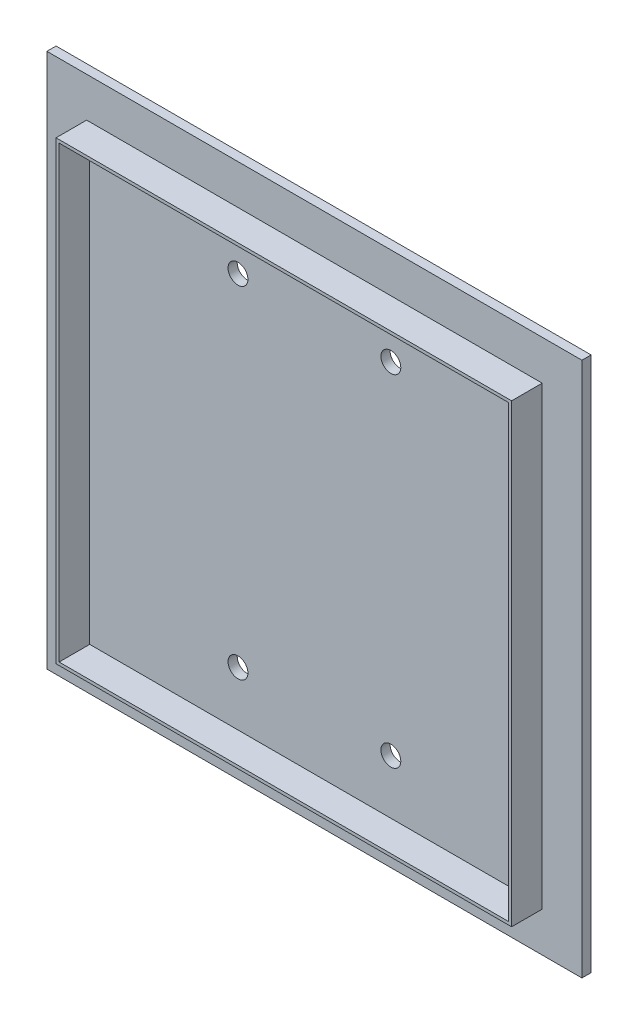
ISO-10303-21;
HEADER;
FILE_DESCRIPTION(('STEP AP214'),'2;1');
FILE_NAME('part.step','',(''),(''),'','','');
FILE_SCHEMA(('AUTOMOTIVE_DESIGN { 1 0 10303 214 1 1 1 1 }'));
ENDSEC;
DATA;
#1=APPLICATION_CONTEXT('core data for automotive mechanical design processes');
#2=APPLICATION_PROTOCOL_DEFINITION('international standard','automotive_design',2000,#1);
#3=PRODUCT_CONTEXT('',#1,'mechanical');
#4=PRODUCT('Part','Part','',(#3));
#5=PRODUCT_RELATED_PRODUCT_CATEGORY('part','',(#4));
#6=PRODUCT_DEFINITION_FORMATION('','',#4);
#7=PRODUCT_DEFINITION_CONTEXT('part definition',#1,'design');
#8=PRODUCT_DEFINITION('design','',#6,#7);
#9=PRODUCT_DEFINITION_SHAPE('','',#8);
#10=(LENGTH_UNIT() NAMED_UNIT(*) SI_UNIT(.MILLI.,.METRE.));
#11=(NAMED_UNIT(*) PLANE_ANGLE_UNIT() SI_UNIT($,.RADIAN.));
#12=(NAMED_UNIT(*) SI_UNIT($,.STERADIAN.) SOLID_ANGLE_UNIT());
#13=UNCERTAINTY_MEASURE_WITH_UNIT(LENGTH_MEASURE(1.E-05),#10,'distance_accuracy_value','');
#14=(GEOMETRIC_REPRESENTATION_CONTEXT(3) GLOBAL_UNCERTAINTY_ASSIGNED_CONTEXT((#13)) GLOBAL_UNIT_ASSIGNED_CONTEXT((#10,
#11,#12)) REPRESENTATION_CONTEXT('',''));
#15=CARTESIAN_POINT('',(0.,0.,0.));
#16=DIRECTION('',(0.,0.,1.));
#17=DIRECTION('',(1.,0.,0.));
#18=AXIS2_PLACEMENT_3D('',#15,#16,#17);
#19=CARTESIAN_POINT('',(0.,0.,0.));
#20=DIRECTION('',(0.,0.,-1.));
#21=DIRECTION('',(-1.,0.,0.));
#22=AXIS2_PLACEMENT_3D('',#19,#20,#21);
#23=PLANE('',#22);
#24=CARTESIAN_POINT('',(-50.,111.5,0.));
#25=DIRECTION('',(0.,0.,-1.));
#26=DIRECTION('',(-1.,0.,0.));
#27=AXIS2_PLACEMENT_3D('',#24,#25,#26);
#28=CIRCLE('',#27,6.50000000000001);
#29=CARTESIAN_POINT('',(-56.5,111.5,0.));
#30=VERTEX_POINT('',#29);
#31=EDGE_CURVE('E228',#30,#30,#28,.F.);
#32=ORIENTED_EDGE('',*,*,#31,.T.);
#33=EDGE_LOOP('',(#32));
#34=FACE_BOUND('',#33,.T.);
#35=CARTESIAN_POINT('',(50.,111.5,0.));
#36=DIRECTION('',(0.,0.,-1.));
#37=DIRECTION('',(-1.,0.,0.));
#38=AXIS2_PLACEMENT_3D('',#35,#36,#37);
#39=CIRCLE('',#38,6.50000000000001);
#40=CARTESIAN_POINT('',(43.5,111.5,0.));
#41=VERTEX_POINT('',#40);
#42=EDGE_CURVE('E225',#41,#41,#39,.T.);
#43=ORIENTED_EDGE('',*,*,#42,.F.);
#44=EDGE_LOOP('',(#43));
#45=FACE_BOUND('',#44,.T.);
#46=DIRECTION('',(0.,1.,0.));
#47=VECTOR('',#46,1.);
#48=CARTESIAN_POINT('',(175.,-175.,0.));
#49=LINE('',#48,#47);
#50=CARTESIAN_POINT('',(175.,-175.,0.));
#51=VERTEX_POINT('',#50);
#52=CARTESIAN_POINT('',(175.,175.,0.));
#53=VERTEX_POINT('',#52);
#54=EDGE_CURVE('E205',#51,#53,#49,.T.);
#55=ORIENTED_EDGE('',*,*,#54,.F.);
#56=DIRECTION('',(1.,0.,0.));
#57=VECTOR('',#56,1.);
#58=CARTESIAN_POINT('',(-175.,-175.,0.));
#59=LINE('',#58,#57);
#60=CARTESIAN_POINT('',(-175.,-175.,0.));
#61=VERTEX_POINT('',#60);
#62=EDGE_CURVE('E214',#61,#51,#59,.T.);
#63=ORIENTED_EDGE('',*,*,#62,.F.);
#64=DIRECTION('',(0.,-1.,0.));
#65=VECTOR('',#64,1.);
#66=CARTESIAN_POINT('',(-175.,-175.,0.));
#67=LINE('',#66,#65);
#68=CARTESIAN_POINT('',(-175.,175.,0.));
#69=VERTEX_POINT('',#68);
#70=EDGE_CURVE('E211',#69,#61,#67,.T.);
#71=ORIENTED_EDGE('',*,*,#70,.F.);
#72=DIRECTION('',(-1.,0.,0.));
#73=VECTOR('',#72,1.);
#74=CARTESIAN_POINT('',(-175.,175.,0.));
#75=LINE('',#74,#73);
#76=EDGE_CURVE('E208',#53,#69,#75,.T.);
#77=ORIENTED_EDGE('',*,*,#76,.F.);
#78=EDGE_LOOP('',(#55,#63,#71,#77));
#79=FACE_BOUND('',#78,.T.);
#80=CARTESIAN_POINT('',(-50.,-111.5,0.));
#81=DIRECTION('',(0.,0.,-1.));
#82=DIRECTION('',(-1.,0.,0.));
#83=AXIS2_PLACEMENT_3D('',#80,#81,#82);
#84=CIRCLE('',#83,6.50000000000001);
#85=CARTESIAN_POINT('',(-56.5,-111.5,0.));
#86=VERTEX_POINT('',#85);
#87=EDGE_CURVE('E231',#86,#86,#84,.T.);
#88=ORIENTED_EDGE('',*,*,#87,.F.);
#89=EDGE_LOOP('',(#88));
#90=FACE_BOUND('',#89,.T.);
#91=CARTESIAN_POINT('',(50.,-111.5,0.));
#92=DIRECTION('',(0.,0.,-1.));
#93=DIRECTION('',(-1.,0.,0.));
#94=AXIS2_PLACEMENT_3D('',#91,#92,#93);
#95=CIRCLE('',#94,6.50000000000001);
#96=CARTESIAN_POINT('',(43.5,-111.5,0.));
#97=VERTEX_POINT('',#96);
#98=EDGE_CURVE('E150',#97,#97,#95,.F.);
#99=ORIENTED_EDGE('',*,*,#98,.T.);
#100=EDGE_LOOP('',(#99));
#101=FACE_BOUND('',#100,.T.);
#102=ADVANCED_FACE('F33',(#34,#45,#79,#90,#101),#23,.T.);
#103=CARTESIAN_POINT('',(0.,0.,6.));
#104=DIRECTION('',(0.,0.,1.));
#105=DIRECTION('',(1.,0.,0.));
#106=AXIS2_PLACEMENT_3D('',#103,#104,#105);
#107=PLANE('',#106);
#108=CARTESIAN_POINT('',(-50.,111.5,6.));
#109=DIRECTION('',(0.,0.,1.));
#110=DIRECTION('',(1.,0.,0.));
#111=AXIS2_PLACEMENT_3D('',#108,#109,#110);
#112=CIRCLE('',#111,6.50000000000001);
#113=CARTESIAN_POINT('',(-56.5,111.5,6.));
#114=VERTEX_POINT('',#113);
#115=EDGE_CURVE('E226',#114,#114,#112,.F.);
#116=ORIENTED_EDGE('',*,*,#115,.T.);
#117=EDGE_LOOP('',(#116));
#118=FACE_BOUND('',#117,.T.);
#119=CARTESIAN_POINT('',(50.,111.5,6.));
#120=DIRECTION('',(0.,0.,1.));
#121=DIRECTION('',(1.,0.,0.));
#122=AXIS2_PLACEMENT_3D('',#119,#120,#121);
#123=CIRCLE('',#122,6.50000000000001);
#124=CARTESIAN_POINT('',(43.5,111.5,6.));
#125=VERTEX_POINT('',#124);
#126=EDGE_CURVE('E222',#125,#125,#123,.T.);
#127=ORIENTED_EDGE('',*,*,#126,.F.);
#128=EDGE_LOOP('',(#127));
#129=FACE_BOUND('',#128,.T.);
#130=DIRECTION('',(0.,1.,0.));
#131=VECTOR('',#130,1.);
#132=CARTESIAN_POINT('',(147.,147.,6.));
#133=LINE('',#132,#131);
#134=CARTESIAN_POINT('',(147.,-147.,6.));
#135=VERTEX_POINT('',#134);
#136=CARTESIAN_POINT('',(147.,147.,6.));
#137=VERTEX_POINT('',#136);
#138=EDGE_CURVE('E125',#135,#137,#133,.T.);
#139=ORIENTED_EDGE('',*,*,#138,.T.);
#140=DIRECTION('',(-1.,0.,0.));
#141=VECTOR('',#140,1.);
#142=CARTESIAN_POINT('',(-147.,147.,6.));
#143=LINE('',#142,#141);
#144=CARTESIAN_POINT('',(-147.,147.,6.));
#145=VERTEX_POINT('',#144);
#146=EDGE_CURVE('E134',#137,#145,#143,.T.);
#147=ORIENTED_EDGE('',*,*,#146,.T.);
#148=DIRECTION('',(0.,-1.,0.));
#149=VECTOR('',#148,1.);
#150=CARTESIAN_POINT('',(-147.,147.,6.));
#151=LINE('',#150,#149);
#152=CARTESIAN_POINT('',(-147.,-147.,6.));
#153=VERTEX_POINT('',#152);
#154=EDGE_CURVE('E139',#145,#153,#151,.T.);
#155=ORIENTED_EDGE('',*,*,#154,.T.);
#156=DIRECTION('',(1.,0.,0.));
#157=VECTOR('',#156,1.);
#158=CARTESIAN_POINT('',(-147.,-147.,6.));
#159=LINE('',#158,#157);
#160=EDGE_CURVE('E131',#153,#135,#159,.T.);
#161=ORIENTED_EDGE('',*,*,#160,.T.);
#162=EDGE_LOOP('',(#139,#147,#155,#161));
#163=FACE_BOUND('',#162,.T.);
#164=CARTESIAN_POINT('',(-50.,-111.5,6.));
#165=DIRECTION('',(0.,0.,1.));
#166=DIRECTION('',(1.,0.,0.));
#167=AXIS2_PLACEMENT_3D('',#164,#165,#166);
#168=CIRCLE('',#167,6.50000000000001);
#169=CARTESIAN_POINT('',(-56.5,-111.5,6.));
#170=VERTEX_POINT('',#169);
#171=EDGE_CURVE('E229',#170,#170,#168,.T.);
#172=ORIENTED_EDGE('',*,*,#171,.F.);
#173=EDGE_LOOP('',(#172));
#174=FACE_BOUND('',#173,.T.);
#175=CARTESIAN_POINT('',(50.,-111.5,6.));
#176=DIRECTION('',(0.,0.,1.));
#177=DIRECTION('',(1.,0.,0.));
#178=AXIS2_PLACEMENT_3D('',#175,#176,#177);
#179=CIRCLE('',#178,6.50000000000001);
#180=CARTESIAN_POINT('',(43.5,-111.5,6.));
#181=VERTEX_POINT('',#180);
#182=EDGE_CURVE('E37',#181,#181,#179,.F.);
#183=ORIENTED_EDGE('',*,*,#182,.T.);
#184=EDGE_LOOP('',(#183));
#185=FACE_BOUND('',#184,.T.);
#186=ADVANCED_FACE('F141',(#118,#129,#163,#174,#185),#107,.T.);
#187=CARTESIAN_POINT('',(175.,-175.,26.));
#188=DIRECTION('',(-1.,0.,0.));
#189=DIRECTION('',(0.,0.,1.));
#190=AXIS2_PLACEMENT_3D('',#187,#188,#189);
#191=PLANE('',#190);
#192=DIRECTION('',(0.,1.,0.));
#193=VECTOR('',#192,1.);
#194=CARTESIAN_POINT('',(175.,175.,6.));
#195=LINE('',#194,#193);
#196=CARTESIAN_POINT('',(175.,-175.,6.));
#197=VERTEX_POINT('',#196);
#198=CARTESIAN_POINT('',(175.,175.,6.));
#199=VERTEX_POINT('',#198);
#200=EDGE_CURVE('E192',#197,#199,#195,.T.);
#201=ORIENTED_EDGE('',*,*,#200,.F.);
#202=DIRECTION('',(0.,0.,-1.));
#203=VECTOR('',#202,1.);
#204=CARTESIAN_POINT('',(175.,-175.,26.));
#205=LINE('',#204,#203);
#206=EDGE_CURVE('E217',#197,#51,#205,.T.);
#207=ORIENTED_EDGE('',*,*,#206,.T.);
#208=ORIENTED_EDGE('',*,*,#54,.T.);
#209=DIRECTION('',(0.,0.,-1.));
#210=VECTOR('',#209,1.);
#211=CARTESIAN_POINT('',(175.,175.,26.));
#212=LINE('',#211,#210);
#213=EDGE_CURVE('E11',#199,#53,#212,.T.);
#214=ORIENTED_EDGE('',*,*,#213,.F.);
#215=EDGE_LOOP('',(#201,#207,#208,#214));
#216=FACE_BOUND('',#215,.T.);
#217=ADVANCED_FACE('F35',(#216),#191,.F.);
#218=CARTESIAN_POINT('',(-175.,175.,26.));
#219=DIRECTION('',(0.,-1.,0.));
#220=DIRECTION('',(0.,0.,-1.));
#221=AXIS2_PLACEMENT_3D('',#218,#219,#220);
#222=PLANE('',#221);
#223=DIRECTION('',(-1.,0.,0.));
#224=VECTOR('',#223,1.);
#225=CARTESIAN_POINT('',(-175.,175.,6.));
#226=LINE('',#225,#224);
#227=CARTESIAN_POINT('',(-175.,175.,6.));
#228=VERTEX_POINT('',#227);
#229=EDGE_CURVE('E200',#199,#228,#226,.T.);
#230=ORIENTED_EDGE('',*,*,#229,.F.);
#231=ORIENTED_EDGE('',*,*,#213,.T.);
#232=ORIENTED_EDGE('',*,*,#76,.T.);
#233=DIRECTION('',(0.,0.,-1.));
#234=VECTOR('',#233,1.);
#235=CARTESIAN_POINT('',(-175.,175.,26.));
#236=LINE('',#235,#234);
#237=EDGE_CURVE('E42',#228,#69,#236,.T.);
#238=ORIENTED_EDGE('',*,*,#237,.F.);
#239=EDGE_LOOP('',(#230,#231,#232,#238));
#240=FACE_BOUND('',#239,.T.);
#241=ADVANCED_FACE('F321',(#240),#222,.F.);
#242=CARTESIAN_POINT('',(-175.,-175.,26.));
#243=DIRECTION('',(1.,0.,0.));
#244=DIRECTION('',(0.,0.,-1.));
#245=AXIS2_PLACEMENT_3D('',#242,#243,#244);
#246=PLANE('',#245);
#247=DIRECTION('',(0.,-1.,0.));
#248=VECTOR('',#247,1.);
#249=CARTESIAN_POINT('',(-175.,175.,6.));
#250=LINE('',#249,#248);
#251=CARTESIAN_POINT('',(-175.,-175.,6.00000000000001));
#252=VERTEX_POINT('',#251);
#253=EDGE_CURVE('E58',#228,#252,#250,.T.);
#254=ORIENTED_EDGE('',*,*,#253,.F.);
#255=ORIENTED_EDGE('',*,*,#237,.T.);
#256=ORIENTED_EDGE('',*,*,#70,.T.);
#257=DIRECTION('',(0.,0.,-1.));
#258=VECTOR('',#257,1.);
#259=CARTESIAN_POINT('',(-175.,-175.,26.));
#260=LINE('',#259,#258);
#261=EDGE_CURVE('E219',#252,#61,#260,.T.);
#262=ORIENTED_EDGE('',*,*,#261,.F.);
#263=EDGE_LOOP('',(#254,#255,#256,#262));
#264=FACE_BOUND('',#263,.T.);
#265=ADVANCED_FACE('F318',(#264),#246,.F.);
#266=CARTESIAN_POINT('',(-175.,-175.,26.));
#267=DIRECTION('',(0.,1.,0.));
#268=DIRECTION('',(0.,0.,1.));
#269=AXIS2_PLACEMENT_3D('',#266,#267,#268);
#270=PLANE('',#269);
#271=DIRECTION('',(1.,0.,0.));
#272=VECTOR('',#271,1.);
#273=CARTESIAN_POINT('',(-175.,-175.,6.));
#274=LINE('',#273,#272);
#275=EDGE_CURVE('E203',#252,#197,#274,.T.);
#276=ORIENTED_EDGE('',*,*,#275,.F.);
#277=ORIENTED_EDGE('',*,*,#261,.T.);
#278=ORIENTED_EDGE('',*,*,#62,.T.);
#279=ORIENTED_EDGE('',*,*,#206,.F.);
#280=EDGE_LOOP('',(#276,#277,#278,#279));
#281=FACE_BOUND('',#280,.T.);
#282=ADVANCED_FACE('F311',(#281),#270,.F.);
#283=CARTESIAN_POINT('',(0.,0.,6.));
#284=DIRECTION('',(0.,0.,1.));
#285=DIRECTION('',(1.,0.,0.));
#286=AXIS2_PLACEMENT_3D('',#283,#284,#285);
#287=PLANE('',#286);
#288=DIRECTION('',(1.,0.,0.));
#289=VECTOR('',#288,1.);
#290=CARTESIAN_POINT('',(-149.,-149.,6.));
#291=LINE('',#290,#289);
#292=CARTESIAN_POINT('',(-149.,-149.,6.));
#293=VERTEX_POINT('',#292);
#294=CARTESIAN_POINT('',(149.,-149.,6.));
#295=VERTEX_POINT('',#294);
#296=EDGE_CURVE('E176',#293,#295,#291,.T.);
#297=ORIENTED_EDGE('',*,*,#296,.F.);
#298=DIRECTION('',(0.,-1.,0.));
#299=VECTOR('',#298,1.);
#300=CARTESIAN_POINT('',(-149.,149.,6.));
#301=LINE('',#300,#299);
#302=CARTESIAN_POINT('',(-149.,149.,6.));
#303=VERTEX_POINT('',#302);
#304=EDGE_CURVE('E173',#303,#293,#301,.T.);
#305=ORIENTED_EDGE('',*,*,#304,.F.);
#306=DIRECTION('',(-1.,0.,0.));
#307=VECTOR('',#306,1.);
#308=CARTESIAN_POINT('',(-149.,149.,6.));
#309=LINE('',#308,#307);
#310=CARTESIAN_POINT('',(149.,149.,6.));
#311=VERTEX_POINT('',#310);
#312=EDGE_CURVE('E169',#311,#303,#309,.T.);
#313=ORIENTED_EDGE('',*,*,#312,.F.);
#314=DIRECTION('',(0.,1.,0.));
#315=VECTOR('',#314,1.);
#316=CARTESIAN_POINT('',(149.,149.,6.));
#317=LINE('',#316,#315);
#318=EDGE_CURVE('E166',#295,#311,#317,.T.);
#319=ORIENTED_EDGE('',*,*,#318,.F.);
#320=EDGE_LOOP('',(#297,#305,#313,#319));
#321=FACE_BOUND('',#320,.T.);
#322=ORIENTED_EDGE('',*,*,#200,.T.);
#323=ORIENTED_EDGE('',*,*,#229,.T.);
#324=ORIENTED_EDGE('',*,*,#253,.T.);
#325=ORIENTED_EDGE('',*,*,#275,.T.);
#326=EDGE_LOOP('',(#322,#323,#324,#325));
#327=FACE_BOUND('',#326,.T.);
#328=ADVANCED_FACE('F307',(#321,#327),#287,.T.);
#329=CARTESIAN_POINT('',(149.,149.,6.));
#330=DIRECTION('',(1.,0.,0.));
#331=DIRECTION('',(0.,1.,0.));
#332=AXIS2_PLACEMENT_3D('',#329,#330,#331);
#333=PLANE('',#332);
#334=DIRECTION('',(0.,1.,0.));
#335=VECTOR('',#334,1.);
#336=CARTESIAN_POINT('',(149.,149.,26.));
#337=LINE('',#336,#335);
#338=CARTESIAN_POINT('',(149.,-149.,26.));
#339=VERTEX_POINT('',#338);
#340=CARTESIAN_POINT('',(149.,149.,26.));
#341=VERTEX_POINT('',#340);
#342=EDGE_CURVE('E162',#339,#341,#337,.T.);
#343=ORIENTED_EDGE('',*,*,#342,.F.);
#344=DIRECTION('',(0.,0.,1.));
#345=VECTOR('',#344,1.);
#346=CARTESIAN_POINT('',(149.,-149.,6.));
#347=LINE('',#346,#345);
#348=EDGE_CURVE('E190',#295,#339,#347,.T.);
#349=ORIENTED_EDGE('',*,*,#348,.F.);
#350=ORIENTED_EDGE('',*,*,#318,.T.);
#351=DIRECTION('',(0.,0.,1.));
#352=VECTOR('',#351,1.);
#353=CARTESIAN_POINT('',(149.,149.,6.));
#354=LINE('',#353,#352);
#355=EDGE_CURVE('E179',#311,#341,#354,.T.);
#356=ORIENTED_EDGE('',*,*,#355,.T.);
#357=EDGE_LOOP('',(#343,#349,#350,#356));
#358=FACE_BOUND('',#357,.T.);
#359=ADVANCED_FACE('F296',(#358),#333,.T.);
#360=CARTESIAN_POINT('',(-149.,-149.,6.));
#361=DIRECTION('',(0.,-1.,0.));
#362=DIRECTION('',(0.,0.,-1.));
#363=AXIS2_PLACEMENT_3D('',#360,#361,#362);
#364=PLANE('',#363);
#365=DIRECTION('',(1.,0.,0.));
#366=VECTOR('',#365,1.);
#367=CARTESIAN_POINT('',(-149.,-149.,26.));
#368=LINE('',#367,#366);
#369=CARTESIAN_POINT('',(-149.,-149.,26.));
#370=VERTEX_POINT('',#369);
#371=EDGE_CURVE('E170',#370,#339,#368,.T.);
#372=ORIENTED_EDGE('',*,*,#371,.F.);
#373=DIRECTION('',(0.,0.,1.));
#374=VECTOR('',#373,1.);
#375=CARTESIAN_POINT('',(-149.,-149.,6.));
#376=LINE('',#375,#374);
#377=EDGE_CURVE('E193',#293,#370,#376,.T.);
#378=ORIENTED_EDGE('',*,*,#377,.F.);
#379=ORIENTED_EDGE('',*,*,#296,.T.);
#380=ORIENTED_EDGE('',*,*,#348,.T.);
#381=EDGE_LOOP('',(#372,#378,#379,#380));
#382=FACE_BOUND('',#381,.T.);
#383=ADVANCED_FACE('F292',(#382),#364,.T.);
#384=CARTESIAN_POINT('',(-149.,149.,6.));
#385=DIRECTION('',(-1.,0.,0.));
#386=DIRECTION('',(0.,-1.,0.));
#387=AXIS2_PLACEMENT_3D('',#384,#385,#386);
#388=PLANE('',#387);
#389=DIRECTION('',(0.,-1.,0.));
#390=VECTOR('',#389,1.);
#391=CARTESIAN_POINT('',(-149.,149.,26.));
#392=LINE('',#391,#390);
#393=CARTESIAN_POINT('',(-149.,149.,26.));
#394=VERTEX_POINT('',#393);
#395=EDGE_CURVE('E185',#394,#370,#392,.T.);
#396=ORIENTED_EDGE('',*,*,#395,.F.);
#397=DIRECTION('',(0.,0.,1.));
#398=VECTOR('',#397,1.);
#399=CARTESIAN_POINT('',(-149.,149.,6.));
#400=LINE('',#399,#398);
#401=EDGE_CURVE('E195',#303,#394,#400,.T.);
#402=ORIENTED_EDGE('',*,*,#401,.F.);
#403=ORIENTED_EDGE('',*,*,#304,.T.);
#404=ORIENTED_EDGE('',*,*,#377,.T.);
#405=EDGE_LOOP('',(#396,#402,#403,#404));
#406=FACE_BOUND('',#405,.T.);
#407=ADVANCED_FACE('F295',(#406),#388,.T.);
#408=CARTESIAN_POINT('',(-149.,149.,6.));
#409=DIRECTION('',(0.,1.,0.));
#410=DIRECTION('',(0.,0.,1.));
#411=AXIS2_PLACEMENT_3D('',#408,#409,#410);
#412=PLANE('',#411);
#413=DIRECTION('',(-1.,0.,0.));
#414=VECTOR('',#413,1.);
#415=CARTESIAN_POINT('',(-149.,149.,26.));
#416=LINE('',#415,#414);
#417=EDGE_CURVE('E182',#341,#394,#416,.T.);
#418=ORIENTED_EDGE('',*,*,#417,.F.);
#419=ORIENTED_EDGE('',*,*,#355,.F.);
#420=ORIENTED_EDGE('',*,*,#312,.T.);
#421=ORIENTED_EDGE('',*,*,#401,.T.);
#422=EDGE_LOOP('',(#418,#419,#420,#421));
#423=FACE_BOUND('',#422,.T.);
#424=ADVANCED_FACE('F300',(#423),#412,.T.);
#425=CARTESIAN_POINT('',(0.,0.,26.));
#426=DIRECTION('',(0.,0.,-1.));
#427=DIRECTION('',(-1.,0.,0.));
#428=AXIS2_PLACEMENT_3D('',#425,#426,#427);
#429=PLANE('',#428);
#430=DIRECTION('',(-1.,0.,0.));
#431=VECTOR('',#430,1.);
#432=CARTESIAN_POINT('',(-147.,147.,26.));
#433=LINE('',#432,#431);
#434=CARTESIAN_POINT('',(147.,147.,26.));
#435=VERTEX_POINT('',#434);
#436=CARTESIAN_POINT('',(-147.,147.,26.));
#437=VERTEX_POINT('',#436);
#438=EDGE_CURVE('E156',#435,#437,#433,.T.);
#439=ORIENTED_EDGE('',*,*,#438,.F.);
#440=DIRECTION('',(0.,1.,0.));
#441=VECTOR('',#440,1.);
#442=CARTESIAN_POINT('',(147.,147.,26.));
#443=LINE('',#442,#441);
#444=CARTESIAN_POINT('',(147.,-147.,26.));
#445=VERTEX_POINT('',#444);
#446=EDGE_CURVE('E50',#445,#435,#443,.T.);
#447=ORIENTED_EDGE('',*,*,#446,.F.);
#448=DIRECTION('',(1.,0.,0.));
#449=VECTOR('',#448,1.);
#450=CARTESIAN_POINT('',(-147.,-147.,26.));
#451=LINE('',#450,#449);
#452=CARTESIAN_POINT('',(-147.,-147.,26.));
#453=VERTEX_POINT('',#452);
#454=EDGE_CURVE('E144',#453,#445,#451,.T.);
#455=ORIENTED_EDGE('',*,*,#454,.F.);
#456=DIRECTION('',(0.,-1.,0.));
#457=VECTOR('',#456,1.);
#458=CARTESIAN_POINT('',(-147.,147.,26.));
#459=LINE('',#458,#457);
#460=EDGE_CURVE('E147',#437,#453,#459,.T.);
#461=ORIENTED_EDGE('',*,*,#460,.F.);
#462=EDGE_LOOP('',(#439,#447,#455,#461));
#463=FACE_BOUND('',#462,.T.);
#464=ORIENTED_EDGE('',*,*,#342,.T.);
#465=ORIENTED_EDGE('',*,*,#417,.T.);
#466=ORIENTED_EDGE('',*,*,#395,.T.);
#467=ORIENTED_EDGE('',*,*,#371,.T.);
#468=EDGE_LOOP('',(#464,#465,#466,#467));
#469=FACE_BOUND('',#468,.T.);
#470=ADVANCED_FACE('F291',(#463,#469),#429,.F.);
#471=CARTESIAN_POINT('',(147.,147.,6.));
#472=DIRECTION('',(1.,0.,0.));
#473=DIRECTION('',(0.,0.,-1.));
#474=AXIS2_PLACEMENT_3D('',#471,#472,#473);
#475=PLANE('',#474);
#476=ORIENTED_EDGE('',*,*,#446,.T.);
#477=DIRECTION('',(0.,0.,1.));
#478=VECTOR('',#477,1.);
#479=CARTESIAN_POINT('',(147.,147.,6.));
#480=LINE('',#479,#478);
#481=EDGE_CURVE('E121',#137,#435,#480,.T.);
#482=ORIENTED_EDGE('',*,*,#481,.F.);
#483=ORIENTED_EDGE('',*,*,#138,.F.);
#484=DIRECTION('',(0.,0.,1.));
#485=VECTOR('',#484,1.);
#486=CARTESIAN_POINT('',(147.,-147.,6.));
#487=LINE('',#486,#485);
#488=EDGE_CURVE('E160',#135,#445,#487,.T.);
#489=ORIENTED_EDGE('',*,*,#488,.T.);
#490=EDGE_LOOP('',(#476,#482,#483,#489));
#491=FACE_BOUND('',#490,.T.);
#492=ADVANCED_FACE('F123',(#491),#475,.F.);
#493=CARTESIAN_POINT('',(-147.,-147.,6.));
#494=DIRECTION('',(0.,-1.,0.));
#495=DIRECTION('',(0.,0.,-1.));
#496=AXIS2_PLACEMENT_3D('',#493,#494,#495);
#497=PLANE('',#496);
#498=ORIENTED_EDGE('',*,*,#454,.T.);
#499=ORIENTED_EDGE('',*,*,#488,.F.);
#500=ORIENTED_EDGE('',*,*,#160,.F.);
#501=DIRECTION('',(0.,0.,1.));
#502=VECTOR('',#501,1.);
#503=CARTESIAN_POINT('',(-147.,-147.,6.));
#504=LINE('',#503,#502);
#505=EDGE_CURVE('E163',#153,#453,#504,.T.);
#506=ORIENTED_EDGE('',*,*,#505,.T.);
#507=EDGE_LOOP('',(#498,#499,#500,#506));
#508=FACE_BOUND('',#507,.T.);
#509=ADVANCED_FACE('F279',(#508),#497,.F.);
#510=CARTESIAN_POINT('',(-147.,147.,6.));
#511=DIRECTION('',(-1.,0.,0.));
#512=DIRECTION('',(0.,-1.,0.));
#513=AXIS2_PLACEMENT_3D('',#510,#511,#512);
#514=PLANE('',#513);
#515=ORIENTED_EDGE('',*,*,#460,.T.);
#516=ORIENTED_EDGE('',*,*,#505,.F.);
#517=ORIENTED_EDGE('',*,*,#154,.F.);
#518=DIRECTION('',(0.,0.,1.));
#519=VECTOR('',#518,1.);
#520=CARTESIAN_POINT('',(-147.,147.,6.));
#521=LINE('',#520,#519);
#522=EDGE_CURVE('E130',#145,#437,#521,.T.);
#523=ORIENTED_EDGE('',*,*,#522,.T.);
#524=EDGE_LOOP('',(#515,#516,#517,#523));
#525=FACE_BOUND('',#524,.T.);
#526=ADVANCED_FACE('F282',(#525),#514,.F.);
#527=CARTESIAN_POINT('',(-147.,147.,6.));
#528=DIRECTION('',(0.,1.,0.));
#529=DIRECTION('',(0.,0.,1.));
#530=AXIS2_PLACEMENT_3D('',#527,#528,#529);
#531=PLANE('',#530);
#532=ORIENTED_EDGE('',*,*,#438,.T.);
#533=ORIENTED_EDGE('',*,*,#522,.F.);
#534=ORIENTED_EDGE('',*,*,#146,.F.);
#535=ORIENTED_EDGE('',*,*,#481,.T.);
#536=EDGE_LOOP('',(#532,#533,#534,#535));
#537=FACE_BOUND('',#536,.T.);
#538=ADVANCED_FACE('F135',(#537),#531,.F.);
#539=CARTESIAN_POINT('',(50.,111.5,26.));
#540=DIRECTION('',(0.,0.,-1.));
#541=DIRECTION('',(-1.,0.,0.));
#542=AXIS2_PLACEMENT_3D('',#539,#540,#541);
#543=CYLINDRICAL_SURFACE('',#542,6.50000000000001);
#544=CARTESIAN_POINT('',(43.5,111.5,0.));
#545=CARTESIAN_POINT('',(43.5,111.5,0.0625000000000001));
#546=CARTESIAN_POINT('',(43.5,111.5,0.125));
#547=CARTESIAN_POINT('',(43.5,111.5,0.25));
#548=CARTESIAN_POINT('',(43.5,111.5,0.3125));
#549=CARTESIAN_POINT('',(43.5,111.5,0.4375));
#550=CARTESIAN_POINT('',(43.5,111.5,0.5));
#551=CARTESIAN_POINT('',(43.5,111.5,0.625000000000001));
#552=CARTESIAN_POINT('',(43.5,111.5,0.687500000000001));
#553=CARTESIAN_POINT('',(43.5,111.5,0.812500000000001));
#554=CARTESIAN_POINT('',(43.5,111.5,0.875000000000001));
#555=CARTESIAN_POINT('',(43.5,111.5,1.));
#556=CARTESIAN_POINT('',(43.5,111.5,1.0625));
#557=CARTESIAN_POINT('',(43.5,111.5,1.1875));
#558=CARTESIAN_POINT('',(43.5,111.5,1.25));
#559=CARTESIAN_POINT('',(43.5,111.5,1.375));
#560=CARTESIAN_POINT('',(43.5,111.5,1.4375));
#561=CARTESIAN_POINT('',(43.5,111.5,1.5625));
#562=CARTESIAN_POINT('',(43.5,111.5,1.625));
#563=CARTESIAN_POINT('',(43.5,111.5,1.75));
#564=CARTESIAN_POINT('',(43.5,111.5,1.8125));
#565=CARTESIAN_POINT('',(43.5,111.5,1.9375));
#566=CARTESIAN_POINT('',(43.5,111.5,2.));
#567=CARTESIAN_POINT('',(43.5,111.5,2.125));
#568=CARTESIAN_POINT('',(43.5,111.5,2.1875));
#569=CARTESIAN_POINT('',(43.5,111.5,2.3125));
#570=CARTESIAN_POINT('',(43.5,111.5,2.375));
#571=CARTESIAN_POINT('',(43.5,111.5,2.5));
#572=CARTESIAN_POINT('',(43.5,111.5,2.5625));
#573=CARTESIAN_POINT('',(43.5,111.5,2.6875));
#574=CARTESIAN_POINT('',(43.5,111.5,2.75));
#575=CARTESIAN_POINT('',(43.5,111.5,2.875));
#576=CARTESIAN_POINT('',(43.5,111.5,2.9375));
#577=CARTESIAN_POINT('',(43.5,111.5,3.0625));
#578=CARTESIAN_POINT('',(43.5,111.5,3.125));
#579=CARTESIAN_POINT('',(43.5,111.5,3.25));
#580=CARTESIAN_POINT('',(43.5,111.5,3.3125));
#581=CARTESIAN_POINT('',(43.5,111.5,3.4375));
#582=CARTESIAN_POINT('',(43.5,111.5,3.5));
#583=CARTESIAN_POINT('',(43.5,111.5,3.625));
#584=CARTESIAN_POINT('',(43.5,111.5,3.6875));
#585=CARTESIAN_POINT('',(43.5,111.5,3.8125));
#586=CARTESIAN_POINT('',(43.5,111.5,3.875));
#587=CARTESIAN_POINT('',(43.5,111.5,4.));
#588=CARTESIAN_POINT('',(43.5,111.5,4.0625));
#589=CARTESIAN_POINT('',(43.5,111.5,4.1875));
#590=CARTESIAN_POINT('',(43.5,111.5,4.25));
#591=CARTESIAN_POINT('',(43.5,111.5,4.375));
#592=CARTESIAN_POINT('',(43.5,111.5,4.4375));
#593=CARTESIAN_POINT('',(43.5,111.5,4.5625));
#594=CARTESIAN_POINT('',(43.5,111.5,4.625));
#595=CARTESIAN_POINT('',(43.5,111.5,4.75));
#596=CARTESIAN_POINT('',(43.5,111.5,4.8125));
#597=CARTESIAN_POINT('',(43.5,111.5,4.9375));
#598=CARTESIAN_POINT('',(43.5,111.5,5.));
#599=CARTESIAN_POINT('',(43.5,111.5,5.125));
#600=CARTESIAN_POINT('',(43.5,111.5,5.1875));
#601=CARTESIAN_POINT('',(43.5,111.5,5.3125));
#602=CARTESIAN_POINT('',(43.5,111.5,5.375));
#603=CARTESIAN_POINT('',(43.5,111.5,5.5));
#604=CARTESIAN_POINT('',(43.5,111.5,5.5625));
#605=CARTESIAN_POINT('',(43.5,111.5,5.6875));
#606=CARTESIAN_POINT('',(43.5,111.5,5.75));
#607=CARTESIAN_POINT('',(43.5,111.5,5.875));
#608=CARTESIAN_POINT('',(43.5,111.5,5.9375));
#609=CARTESIAN_POINT('',(43.5,111.5,6.));
#610=B_SPLINE_CURVE_WITH_KNOTS('',3,(#544,#545,#546,#547,#548,#549,#550,#551,#552,#553,#554,
#555,#556,#557,#558,#559,#560,#561,#562,#563,#564,#565,#566,#567,#568,#569,#570,#571,#572,#573,
#574,#575,#576,#577,#578,#579,#580,#581,#582,#583,#584,#585,#586,#587,#588,#589,#590,#591,#592,
#593,#594,#595,#596,#597,#598,#599,#600,#601,#602,#603,#604,#605,#606,#607,#608,#609),
.UNSPECIFIED.,.F.,.F.,(4,2,2,2,2,2,2,2,2,2,2,2,2,2,2,2,2,2,2,2,2,2,2,2,2,2,2,2,2,2,2,2,4),(0.,
0.1875,0.375,0.5625,0.750000000000001,0.937500000000001,1.125,1.3125,1.5,1.6875,1.875,2.0625,
2.25,2.4375,2.625,2.8125,3.,3.1875,3.375,3.5625,3.75,3.9375,4.125,4.3125,4.5,4.6875,4.875,
5.0625,5.25,5.4375,5.625,5.8125,6.),.UNSPECIFIED.);
#611=EDGE_CURVE('BSEAM243',#41,#125,#610,.T.);
#612=ORIENTED_EDGE('',*,*,#42,.T.);
#613=ORIENTED_EDGE('',*,*,#126,.T.);
#614=ORIENTED_EDGE('',*,*,#611,.T.);
#615=ORIENTED_EDGE('',*,*,#611,.F.);
#616=EDGE_LOOP('',(#612,#614,#613,#615));
#617=FACE_BOUND('',#616,.T.);
#618=ADVANCED_FACE('F243',(#617),#543,.F.);
#619=CARTESIAN_POINT('',(-50.,111.5,26.));
#620=DIRECTION('',(0.,0.,-1.));
#621=DIRECTION('',(-1.,0.,0.));
#622=AXIS2_PLACEMENT_3D('',#619,#620,#621);
#623=CYLINDRICAL_SURFACE('',#622,6.50000000000001);
#624=CARTESIAN_POINT('',(-56.5,111.5,0.));
#625=CARTESIAN_POINT('',(-56.5,111.5,0.0625000000000001));
#626=CARTESIAN_POINT('',(-56.5,111.5,0.125));
#627=CARTESIAN_POINT('',(-56.5,111.5,0.25));
#628=CARTESIAN_POINT('',(-56.5,111.5,0.3125));
#629=CARTESIAN_POINT('',(-56.5,111.5,0.4375));
#630=CARTESIAN_POINT('',(-56.5,111.5,0.5));
#631=CARTESIAN_POINT('',(-56.5,111.5,0.625000000000001));
#632=CARTESIAN_POINT('',(-56.5,111.5,0.687500000000001));
#633=CARTESIAN_POINT('',(-56.5,111.5,0.812500000000001));
#634=CARTESIAN_POINT('',(-56.5,111.5,0.875000000000001));
#635=CARTESIAN_POINT('',(-56.5,111.5,1.));
#636=CARTESIAN_POINT('',(-56.5,111.5,1.0625));
#637=CARTESIAN_POINT('',(-56.5,111.5,1.1875));
#638=CARTESIAN_POINT('',(-56.5,111.5,1.25));
#639=CARTESIAN_POINT('',(-56.5,111.5,1.375));
#640=CARTESIAN_POINT('',(-56.5,111.5,1.4375));
#641=CARTESIAN_POINT('',(-56.5,111.5,1.5625));
#642=CARTESIAN_POINT('',(-56.5,111.5,1.625));
#643=CARTESIAN_POINT('',(-56.5,111.5,1.75));
#644=CARTESIAN_POINT('',(-56.5,111.5,1.8125));
#645=CARTESIAN_POINT('',(-56.5,111.5,1.9375));
#646=CARTESIAN_POINT('',(-56.5,111.5,2.));
#647=CARTESIAN_POINT('',(-56.5,111.5,2.125));
#648=CARTESIAN_POINT('',(-56.5,111.5,2.1875));
#649=CARTESIAN_POINT('',(-56.5,111.5,2.3125));
#650=CARTESIAN_POINT('',(-56.5,111.5,2.375));
#651=CARTESIAN_POINT('',(-56.5,111.5,2.5));
#652=CARTESIAN_POINT('',(-56.5,111.5,2.5625));
#653=CARTESIAN_POINT('',(-56.5,111.5,2.6875));
#654=CARTESIAN_POINT('',(-56.5,111.5,2.75));
#655=CARTESIAN_POINT('',(-56.5,111.5,2.875));
#656=CARTESIAN_POINT('',(-56.5,111.5,2.9375));
#657=CARTESIAN_POINT('',(-56.5,111.5,3.0625));
#658=CARTESIAN_POINT('',(-56.5,111.5,3.125));
#659=CARTESIAN_POINT('',(-56.5,111.5,3.25));
#660=CARTESIAN_POINT('',(-56.5,111.5,3.3125));
#661=CARTESIAN_POINT('',(-56.5,111.5,3.4375));
#662=CARTESIAN_POINT('',(-56.5,111.5,3.5));
#663=CARTESIAN_POINT('',(-56.5,111.5,3.625));
#664=CARTESIAN_POINT('',(-56.5,111.5,3.6875));
#665=CARTESIAN_POINT('',(-56.5,111.5,3.8125));
#666=CARTESIAN_POINT('',(-56.5,111.5,3.875));
#667=CARTESIAN_POINT('',(-56.5,111.5,4.));
#668=CARTESIAN_POINT('',(-56.5,111.5,4.0625));
#669=CARTESIAN_POINT('',(-56.5,111.5,4.1875));
#670=CARTESIAN_POINT('',(-56.5,111.5,4.25));
#671=CARTESIAN_POINT('',(-56.5,111.5,4.375));
#672=CARTESIAN_POINT('',(-56.5,111.5,4.4375));
#673=CARTESIAN_POINT('',(-56.5,111.5,4.5625));
#674=CARTESIAN_POINT('',(-56.5,111.5,4.625));
#675=CARTESIAN_POINT('',(-56.5,111.5,4.75));
#676=CARTESIAN_POINT('',(-56.5,111.5,4.8125));
#677=CARTESIAN_POINT('',(-56.5,111.5,4.9375));
#678=CARTESIAN_POINT('',(-56.5,111.5,5.));
#679=CARTESIAN_POINT('',(-56.5,111.5,5.125));
#680=CARTESIAN_POINT('',(-56.5,111.5,5.1875));
#681=CARTESIAN_POINT('',(-56.5,111.5,5.3125));
#682=CARTESIAN_POINT('',(-56.5,111.5,5.375));
#683=CARTESIAN_POINT('',(-56.5,111.5,5.5));
#684=CARTESIAN_POINT('',(-56.5,111.5,5.5625));
#685=CARTESIAN_POINT('',(-56.5,111.5,5.6875));
#686=CARTESIAN_POINT('',(-56.5,111.5,5.75));
#687=CARTESIAN_POINT('',(-56.5,111.5,5.875));
#688=CARTESIAN_POINT('',(-56.5,111.5,5.9375));
#689=CARTESIAN_POINT('',(-56.5,111.5,6.));
#690=B_SPLINE_CURVE_WITH_KNOTS('',3,(#624,#625,#626,#627,#628,#629,#630,#631,#632,#633,#634,
#635,#636,#637,#638,#639,#640,#641,#642,#643,#644,#645,#646,#647,#648,#649,#650,#651,#652,#653,
#654,#655,#656,#657,#658,#659,#660,#661,#662,#663,#664,#665,#666,#667,#668,#669,#670,#671,#672,
#673,#674,#675,#676,#677,#678,#679,#680,#681,#682,#683,#684,#685,#686,#687,#688,#689),
.UNSPECIFIED.,.F.,.F.,(4,2,2,2,2,2,2,2,2,2,2,2,2,2,2,2,2,2,2,2,2,2,2,2,2,2,2,2,2,2,2,2,4),(0.,
0.1875,0.375,0.5625,0.750000000000001,0.937500000000001,1.125,1.3125,1.5,1.6875,1.875,2.0625,
2.25,2.4375,2.625,2.8125,3.,3.1875,3.375,3.5625,3.75,3.9375,4.125,4.3125,4.5,4.6875,4.875,
5.0625,5.25,5.4375,5.625,5.8125,6.),.UNSPECIFIED.);
#691=EDGE_CURVE('BSEAM269',#30,#114,#690,.T.);
#692=ORIENTED_EDGE('',*,*,#31,.F.);
#693=ORIENTED_EDGE('',*,*,#115,.F.);
#694=ORIENTED_EDGE('',*,*,#691,.T.);
#695=ORIENTED_EDGE('',*,*,#691,.F.);
#696=EDGE_LOOP('',(#692,#694,#693,#695));
#697=FACE_BOUND('',#696,.T.);
#698=ADVANCED_FACE('F269',(#697),#623,.F.);
#699=CARTESIAN_POINT('',(-50.,-111.5,26.));
#700=DIRECTION('',(0.,0.,-1.));
#701=DIRECTION('',(-1.,0.,0.));
#702=AXIS2_PLACEMENT_3D('',#699,#700,#701);
#703=CYLINDRICAL_SURFACE('',#702,6.50000000000001);
#704=CARTESIAN_POINT('',(-56.5,-111.5,0.));
#705=CARTESIAN_POINT('',(-56.5,-111.5,0.0625000000000001));
#706=CARTESIAN_POINT('',(-56.5,-111.5,0.125));
#707=CARTESIAN_POINT('',(-56.5,-111.5,0.25));
#708=CARTESIAN_POINT('',(-56.5,-111.5,0.3125));
#709=CARTESIAN_POINT('',(-56.5,-111.5,0.4375));
#710=CARTESIAN_POINT('',(-56.5,-111.5,0.5));
#711=CARTESIAN_POINT('',(-56.5,-111.5,0.625000000000001));
#712=CARTESIAN_POINT('',(-56.5,-111.5,0.687500000000001));
#713=CARTESIAN_POINT('',(-56.5,-111.5,0.812500000000001));
#714=CARTESIAN_POINT('',(-56.5,-111.5,0.875000000000001));
#715=CARTESIAN_POINT('',(-56.5,-111.5,1.));
#716=CARTESIAN_POINT('',(-56.5,-111.5,1.0625));
#717=CARTESIAN_POINT('',(-56.5,-111.5,1.1875));
#718=CARTESIAN_POINT('',(-56.5,-111.5,1.25));
#719=CARTESIAN_POINT('',(-56.5,-111.5,1.375));
#720=CARTESIAN_POINT('',(-56.5,-111.5,1.4375));
#721=CARTESIAN_POINT('',(-56.5,-111.5,1.5625));
#722=CARTESIAN_POINT('',(-56.5,-111.5,1.625));
#723=CARTESIAN_POINT('',(-56.5,-111.5,1.75));
#724=CARTESIAN_POINT('',(-56.5,-111.5,1.8125));
#725=CARTESIAN_POINT('',(-56.5,-111.5,1.9375));
#726=CARTESIAN_POINT('',(-56.5,-111.5,2.));
#727=CARTESIAN_POINT('',(-56.5,-111.5,2.125));
#728=CARTESIAN_POINT('',(-56.5,-111.5,2.1875));
#729=CARTESIAN_POINT('',(-56.5,-111.5,2.3125));
#730=CARTESIAN_POINT('',(-56.5,-111.5,2.375));
#731=CARTESIAN_POINT('',(-56.5,-111.5,2.5));
#732=CARTESIAN_POINT('',(-56.5,-111.5,2.5625));
#733=CARTESIAN_POINT('',(-56.5,-111.5,2.6875));
#734=CARTESIAN_POINT('',(-56.5,-111.5,2.75));
#735=CARTESIAN_POINT('',(-56.5,-111.5,2.875));
#736=CARTESIAN_POINT('',(-56.5,-111.5,2.9375));
#737=CARTESIAN_POINT('',(-56.5,-111.5,3.0625));
#738=CARTESIAN_POINT('',(-56.5,-111.5,3.125));
#739=CARTESIAN_POINT('',(-56.5,-111.5,3.25));
#740=CARTESIAN_POINT('',(-56.5,-111.5,3.3125));
#741=CARTESIAN_POINT('',(-56.5,-111.5,3.4375));
#742=CARTESIAN_POINT('',(-56.5,-111.5,3.5));
#743=CARTESIAN_POINT('',(-56.5,-111.5,3.625));
#744=CARTESIAN_POINT('',(-56.5,-111.5,3.6875));
#745=CARTESIAN_POINT('',(-56.5,-111.5,3.8125));
#746=CARTESIAN_POINT('',(-56.5,-111.5,3.875));
#747=CARTESIAN_POINT('',(-56.5,-111.5,4.));
#748=CARTESIAN_POINT('',(-56.5,-111.5,4.0625));
#749=CARTESIAN_POINT('',(-56.5,-111.5,4.1875));
#750=CARTESIAN_POINT('',(-56.5,-111.5,4.25));
#751=CARTESIAN_POINT('',(-56.5,-111.5,4.375));
#752=CARTESIAN_POINT('',(-56.5,-111.5,4.4375));
#753=CARTESIAN_POINT('',(-56.5,-111.5,4.5625));
#754=CARTESIAN_POINT('',(-56.5,-111.5,4.625));
#755=CARTESIAN_POINT('',(-56.5,-111.5,4.75));
#756=CARTESIAN_POINT('',(-56.5,-111.5,4.8125));
#757=CARTESIAN_POINT('',(-56.5,-111.5,4.9375));
#758=CARTESIAN_POINT('',(-56.5,-111.5,5.));
#759=CARTESIAN_POINT('',(-56.5,-111.5,5.125));
#760=CARTESIAN_POINT('',(-56.5,-111.5,5.1875));
#761=CARTESIAN_POINT('',(-56.5,-111.5,5.3125));
#762=CARTESIAN_POINT('',(-56.5,-111.5,5.375));
#763=CARTESIAN_POINT('',(-56.5,-111.5,5.5));
#764=CARTESIAN_POINT('',(-56.5,-111.5,5.5625));
#765=CARTESIAN_POINT('',(-56.5,-111.5,5.6875));
#766=CARTESIAN_POINT('',(-56.5,-111.5,5.75));
#767=CARTESIAN_POINT('',(-56.5,-111.5,5.875));
#768=CARTESIAN_POINT('',(-56.5,-111.5,5.9375));
#769=CARTESIAN_POINT('',(-56.5,-111.5,6.));
#770=B_SPLINE_CURVE_WITH_KNOTS('',3,(#704,#705,#706,#707,#708,#709,#710,#711,#712,#713,#714,
#715,#716,#717,#718,#719,#720,#721,#722,#723,#724,#725,#726,#727,#728,#729,#730,#731,#732,#733,
#734,#735,#736,#737,#738,#739,#740,#741,#742,#743,#744,#745,#746,#747,#748,#749,#750,#751,#752,
#753,#754,#755,#756,#757,#758,#759,#760,#761,#762,#763,#764,#765,#766,#767,#768,#769),
.UNSPECIFIED.,.F.,.F.,(4,2,2,2,2,2,2,2,2,2,2,2,2,2,2,2,2,2,2,2,2,2,2,2,2,2,2,2,2,2,2,2,4),(0.,
0.1875,0.375,0.5625,0.750000000000001,0.937500000000001,1.125,1.3125,1.5,1.6875,1.875,2.0625,
2.25,2.4375,2.625,2.8125,3.,3.1875,3.375,3.5625,3.75,3.9375,4.125,4.3125,4.5,4.6875,4.875,
5.0625,5.25,5.4375,5.625,5.8125,6.),.UNSPECIFIED.);
#771=EDGE_CURVE('BSEAM264',#86,#170,#770,.T.);
#772=ORIENTED_EDGE('',*,*,#87,.T.);
#773=ORIENTED_EDGE('',*,*,#171,.T.);
#774=ORIENTED_EDGE('',*,*,#771,.T.);
#775=ORIENTED_EDGE('',*,*,#771,.F.);
#776=EDGE_LOOP('',(#772,#774,#773,#775));
#777=FACE_BOUND('',#776,.T.);
#778=ADVANCED_FACE('F264',(#777),#703,.F.);
#779=CARTESIAN_POINT('',(50.,-111.5,26.));
#780=DIRECTION('',(0.,0.,-1.));
#781=DIRECTION('',(-1.,0.,0.));
#782=AXIS2_PLACEMENT_3D('',#779,#780,#781);
#783=CYLINDRICAL_SURFACE('',#782,6.50000000000001);
#784=CARTESIAN_POINT('',(43.5,-111.5,0.));
#785=CARTESIAN_POINT('',(43.5,-111.5,0.0625000000000001));
#786=CARTESIAN_POINT('',(43.5,-111.5,0.125));
#787=CARTESIAN_POINT('',(43.5,-111.5,0.25));
#788=CARTESIAN_POINT('',(43.5,-111.5,0.3125));
#789=CARTESIAN_POINT('',(43.5,-111.5,0.4375));
#790=CARTESIAN_POINT('',(43.5,-111.5,0.5));
#791=CARTESIAN_POINT('',(43.5,-111.5,0.625000000000001));
#792=CARTESIAN_POINT('',(43.5,-111.5,0.687500000000001));
#793=CARTESIAN_POINT('',(43.5,-111.5,0.812500000000001));
#794=CARTESIAN_POINT('',(43.5,-111.5,0.875000000000001));
#795=CARTESIAN_POINT('',(43.5,-111.5,1.));
#796=CARTESIAN_POINT('',(43.5,-111.5,1.0625));
#797=CARTESIAN_POINT('',(43.5,-111.5,1.1875));
#798=CARTESIAN_POINT('',(43.5,-111.5,1.25));
#799=CARTESIAN_POINT('',(43.5,-111.5,1.375));
#800=CARTESIAN_POINT('',(43.5,-111.5,1.4375));
#801=CARTESIAN_POINT('',(43.5,-111.5,1.5625));
#802=CARTESIAN_POINT('',(43.5,-111.5,1.625));
#803=CARTESIAN_POINT('',(43.5,-111.5,1.75));
#804=CARTESIAN_POINT('',(43.5,-111.5,1.8125));
#805=CARTESIAN_POINT('',(43.5,-111.5,1.9375));
#806=CARTESIAN_POINT('',(43.5,-111.5,2.));
#807=CARTESIAN_POINT('',(43.5,-111.5,2.125));
#808=CARTESIAN_POINT('',(43.5,-111.5,2.1875));
#809=CARTESIAN_POINT('',(43.5,-111.5,2.3125));
#810=CARTESIAN_POINT('',(43.5,-111.5,2.375));
#811=CARTESIAN_POINT('',(43.5,-111.5,2.5));
#812=CARTESIAN_POINT('',(43.5,-111.5,2.5625));
#813=CARTESIAN_POINT('',(43.5,-111.5,2.6875));
#814=CARTESIAN_POINT('',(43.5,-111.5,2.75));
#815=CARTESIAN_POINT('',(43.5,-111.5,2.875));
#816=CARTESIAN_POINT('',(43.5,-111.5,2.9375));
#817=CARTESIAN_POINT('',(43.5,-111.5,3.0625));
#818=CARTESIAN_POINT('',(43.5,-111.5,3.125));
#819=CARTESIAN_POINT('',(43.5,-111.5,3.25));
#820=CARTESIAN_POINT('',(43.5,-111.5,3.3125));
#821=CARTESIAN_POINT('',(43.5,-111.5,3.4375));
#822=CARTESIAN_POINT('',(43.5,-111.5,3.5));
#823=CARTESIAN_POINT('',(43.5,-111.5,3.625));
#824=CARTESIAN_POINT('',(43.5,-111.5,3.6875));
#825=CARTESIAN_POINT('',(43.5,-111.5,3.8125));
#826=CARTESIAN_POINT('',(43.5,-111.5,3.875));
#827=CARTESIAN_POINT('',(43.5,-111.5,4.));
#828=CARTESIAN_POINT('',(43.5,-111.5,4.0625));
#829=CARTESIAN_POINT('',(43.5,-111.5,4.1875));
#830=CARTESIAN_POINT('',(43.5,-111.5,4.25));
#831=CARTESIAN_POINT('',(43.5,-111.5,4.375));
#832=CARTESIAN_POINT('',(43.5,-111.5,4.4375));
#833=CARTESIAN_POINT('',(43.5,-111.5,4.5625));
#834=CARTESIAN_POINT('',(43.5,-111.5,4.625));
#835=CARTESIAN_POINT('',(43.5,-111.5,4.75));
#836=CARTESIAN_POINT('',(43.5,-111.5,4.8125));
#837=CARTESIAN_POINT('',(43.5,-111.5,4.9375));
#838=CARTESIAN_POINT('',(43.5,-111.5,5.));
#839=CARTESIAN_POINT('',(43.5,-111.5,5.125));
#840=CARTESIAN_POINT('',(43.5,-111.5,5.1875));
#841=CARTESIAN_POINT('',(43.5,-111.5,5.3125));
#842=CARTESIAN_POINT('',(43.5,-111.5,5.375));
#843=CARTESIAN_POINT('',(43.5,-111.5,5.5));
#844=CARTESIAN_POINT('',(43.5,-111.5,5.5625));
#845=CARTESIAN_POINT('',(43.5,-111.5,5.6875));
#846=CARTESIAN_POINT('',(43.5,-111.5,5.75));
#847=CARTESIAN_POINT('',(43.5,-111.5,5.875));
#848=CARTESIAN_POINT('',(43.5,-111.5,5.9375));
#849=CARTESIAN_POINT('',(43.5,-111.5,6.));
#850=B_SPLINE_CURVE_WITH_KNOTS('',3,(#784,#785,#786,#787,#788,#789,#790,#791,#792,#793,#794,
#795,#796,#797,#798,#799,#800,#801,#802,#803,#804,#805,#806,#807,#808,#809,#810,#811,#812,#813,
#814,#815,#816,#817,#818,#819,#820,#821,#822,#823,#824,#825,#826,#827,#828,#829,#830,#831,#832,
#833,#834,#835,#836,#837,#838,#839,#840,#841,#842,#843,#844,#845,#846,#847,#848,#849),
.UNSPECIFIED.,.F.,.F.,(4,2,2,2,2,2,2,2,2,2,2,2,2,2,2,2,2,2,2,2,2,2,2,2,2,2,2,2,2,2,2,2,4),(0.,
0.1875,0.375,0.5625,0.750000000000001,0.937500000000001,1.125,1.3125,1.5,1.6875,1.875,2.0625,
2.25,2.4375,2.625,2.8125,3.,3.1875,3.375,3.5625,3.75,3.9375,4.125,4.3125,4.5,4.6875,4.875,
5.0625,5.25,5.4375,5.625,5.8125,6.),.UNSPECIFIED.);
#851=EDGE_CURVE('BSEAM262',#97,#181,#850,.T.);
#852=ORIENTED_EDGE('',*,*,#98,.F.);
#853=ORIENTED_EDGE('',*,*,#182,.F.);
#854=ORIENTED_EDGE('',*,*,#851,.T.);
#855=ORIENTED_EDGE('',*,*,#851,.F.);
#856=EDGE_LOOP('',(#852,#854,#853,#855));
#857=FACE_BOUND('',#856,.T.);
#858=ADVANCED_FACE('F262',(#857),#783,.F.);
#859=CLOSED_SHELL('',(#102,#186,#217,#241,#265,#282,#328,#359,#383,#407,#424,#470,#492,#509,
#526,#538,#618,#698,#778,#858));
#860=MANIFOLD_SOLID_BREP('B2',#859);
#861=ADVANCED_BREP_SHAPE_REPRESENTATION('',(#18,#860),#14);
#862=SHAPE_DEFINITION_REPRESENTATION(#9,#861);
ENDSEC;
END-ISO-10303-21;
